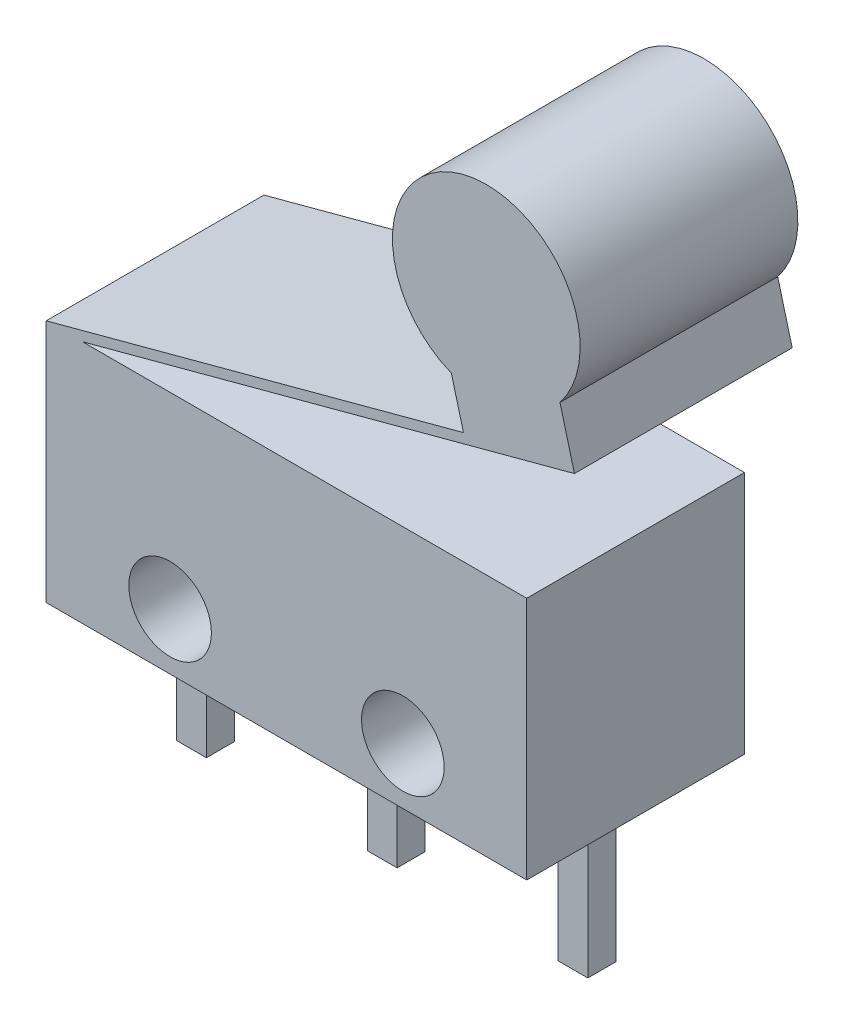
ISO-10303-21;
HEADER;
FILE_DESCRIPTION(('STEP AP214'),'2;1');
FILE_NAME('part.step','',(''),(''),'','','');
FILE_SCHEMA(('AUTOMOTIVE_DESIGN { 1 0 10303 214 1 1 1 1 }'));
ENDSEC;
DATA;
#1=APPLICATION_CONTEXT('core data for automotive mechanical design processes');
#2=APPLICATION_PROTOCOL_DEFINITION('international standard','automotive_design',2000,#1);
#3=PRODUCT_CONTEXT('',#1,'mechanical');
#4=PRODUCT('Part','Part','',(#3));
#5=PRODUCT_RELATED_PRODUCT_CATEGORY('part','',(#4));
#6=PRODUCT_DEFINITION_FORMATION('','',#4);
#7=PRODUCT_DEFINITION_CONTEXT('part definition',#1,'design');
#8=PRODUCT_DEFINITION('design','',#6,#7);
#9=PRODUCT_DEFINITION_SHAPE('','',#8);
#10=(LENGTH_UNIT() NAMED_UNIT(*) SI_UNIT(.MILLI.,.METRE.));
#11=(NAMED_UNIT(*) PLANE_ANGLE_UNIT() SI_UNIT($,.RADIAN.));
#12=(NAMED_UNIT(*) SI_UNIT($,.STERADIAN.) SOLID_ANGLE_UNIT());
#13=UNCERTAINTY_MEASURE_WITH_UNIT(LENGTH_MEASURE(1.E-05),#10,'distance_accuracy_value','');
#14=(GEOMETRIC_REPRESENTATION_CONTEXT(3) GLOBAL_UNCERTAINTY_ASSIGNED_CONTEXT((#13)) GLOBAL_UNIT_ASSIGNED_CONTEXT((#10,
#11,#12)) REPRESENTATION_CONTEXT('',''));
#15=CARTESIAN_POINT('',(0.,0.,0.));
#16=DIRECTION('',(0.,0.,1.));
#17=DIRECTION('',(1.,0.,0.));
#18=AXIS2_PLACEMENT_3D('',#15,#16,#17);
#19=CARTESIAN_POINT('',(0.,0.,5.8));
#20=DIRECTION('',(0.,1.,0.));
#21=DIRECTION('',(0.,0.,1.));
#22=AXIS2_PLACEMENT_3D('',#19,#20,#21);
#23=PLANE('',#22);
#24=DIRECTION('',(0.,0.,-1.));
#25=VECTOR('',#24,1.);
#26=CARTESIAN_POINT('',(6.00191984051225,0.,3.24693340619028));
#27=LINE('',#26,#25);
#28=CARTESIAN_POINT('',(6.00191984051225,0.,3.24693340619028));
#29=VERTEX_POINT('',#28);
#30=CARTESIAN_POINT('',(6.00191984051225,0.,2.49846668640546));
#31=VERTEX_POINT('',#30);
#32=EDGE_CURVE('E196',#29,#31,#27,.T.);
#33=ORIENTED_EDGE('',*,*,#32,.F.);
#34=DIRECTION('',(-1.,0.,0.));
#35=VECTOR('',#34,1.);
#36=CARTESIAN_POINT('',(6.00191984051225,0.,3.24693340619028));
#37=LINE('',#36,#35);
#38=CARTESIAN_POINT('',(6.79356733259234,0.,3.24693340619028));
#39=VERTEX_POINT('',#38);
#40=EDGE_CURVE('E209',#39,#29,#37,.T.);
#41=ORIENTED_EDGE('',*,*,#40,.F.);
#42=DIRECTION('',(0.,0.,1.));
#43=VECTOR('',#42,1.);
#44=CARTESIAN_POINT('',(6.79356733259234,0.,3.24693340619028));
#45=LINE('',#44,#43);
#46=CARTESIAN_POINT('',(6.79356733259234,0.,2.49846668640546));
#47=VERTEX_POINT('',#46);
#48=EDGE_CURVE('E218',#47,#39,#45,.T.);
#49=ORIENTED_EDGE('',*,*,#48,.F.);
#50=DIRECTION('',(1.,0.,0.));
#51=VECTOR('',#50,1.);
#52=CARTESIAN_POINT('',(6.00191984051225,0.,2.49846668640546));
#53=LINE('',#52,#51);
#54=EDGE_CURVE('E199',#31,#47,#53,.T.);
#55=ORIENTED_EDGE('',*,*,#54,.F.);
#56=EDGE_LOOP('',(#33,#41,#49,#55));
#57=FACE_BOUND('',#56,.T.);
#58=DIRECTION('',(1.,0.,0.));
#59=VECTOR('',#58,1.);
#60=CARTESIAN_POINT('',(0.,0.,0.));
#61=LINE('',#60,#59);
#62=CARTESIAN_POINT('',(0.,0.,0.));
#63=VERTEX_POINT('',#62);
#64=CARTESIAN_POINT('',(12.8,0.,0.));
#65=VERTEX_POINT('',#64);
#66=EDGE_CURVE('E313',#63,#65,#61,.T.);
#67=ORIENTED_EDGE('',*,*,#66,.T.);
#68=DIRECTION('',(0.,0.,-1.));
#69=VECTOR('',#68,1.);
#70=CARTESIAN_POINT('',(12.8,0.,5.8));
#71=LINE('',#70,#69);
#72=CARTESIAN_POINT('',(12.8,0.,5.8));
#73=VERTEX_POINT('',#72);
#74=EDGE_CURVE('E329',#73,#65,#71,.T.);
#75=ORIENTED_EDGE('',*,*,#74,.F.);
#76=DIRECTION('',(1.,0.,0.));
#77=VECTOR('',#76,1.);
#78=CARTESIAN_POINT('',(0.,0.,5.8));
#79=LINE('',#78,#77);
#80=CARTESIAN_POINT('',(0.,0.,5.8));
#81=VERTEX_POINT('',#80);
#82=EDGE_CURVE('E284',#81,#73,#79,.T.);
#83=ORIENTED_EDGE('',*,*,#82,.F.);
#84=DIRECTION('',(0.,0.,-1.));
#85=VECTOR('',#84,1.);
#86=CARTESIAN_POINT('',(0.,0.,5.8));
#87=LINE('',#86,#85);
#88=EDGE_CURVE('E332',#81,#63,#87,.T.);
#89=ORIENTED_EDGE('',*,*,#88,.T.);
#90=EDGE_LOOP('',(#67,#75,#83,#89));
#91=FACE_BOUND('',#90,.T.);
#92=DIRECTION('',(0.,0.,-1.));
#93=VECTOR('',#92,1.);
#94=CARTESIAN_POINT('',(0.921919840512247,0.,3.24693340619028));
#95=LINE('',#94,#93);
#96=CARTESIAN_POINT('',(0.921919840512247,0.,3.24693340619028));
#97=VERTEX_POINT('',#96);
#98=CARTESIAN_POINT('',(0.921919840512247,0.,2.49846668640546));
#99=VERTEX_POINT('',#98);
#100=EDGE_CURVE('E234',#97,#99,#95,.T.);
#101=ORIENTED_EDGE('',*,*,#100,.F.);
#102=DIRECTION('',(-1.,0.,0.));
#103=VECTOR('',#102,1.);
#104=CARTESIAN_POINT('',(0.921919840512247,0.,3.24693340619028));
#105=LINE('',#104,#103);
#106=CARTESIAN_POINT('',(1.71356733259234,0.,3.24693340619028));
#107=VERTEX_POINT('',#106);
#108=EDGE_CURVE('E239',#107,#97,#105,.T.);
#109=ORIENTED_EDGE('',*,*,#108,.F.);
#110=DIRECTION('',(0.,0.,1.));
#111=VECTOR('',#110,1.);
#112=CARTESIAN_POINT('',(1.71356733259234,0.,3.24693340619028));
#113=LINE('',#112,#111);
#114=CARTESIAN_POINT('',(1.71356733259234,0.,2.49846668640546));
#115=VERTEX_POINT('',#114);
#116=EDGE_CURVE('E251',#115,#107,#113,.T.);
#117=ORIENTED_EDGE('',*,*,#116,.F.);
#118=DIRECTION('',(1.,0.,0.));
#119=VECTOR('',#118,1.);
#120=CARTESIAN_POINT('',(0.921919840512247,0.,2.49846668640546));
#121=LINE('',#120,#119);
#122=EDGE_CURVE('E248',#99,#115,#121,.T.);
#123=ORIENTED_EDGE('',*,*,#122,.F.);
#124=EDGE_LOOP('',(#101,#109,#117,#123));
#125=FACE_BOUND('',#124,.T.);
#126=DIRECTION('',(0.,0.,-1.));
#127=VECTOR('',#126,1.);
#128=CARTESIAN_POINT('',(11.0819198405122,0.,3.24693340619028));
#129=LINE('',#128,#127);
#130=CARTESIAN_POINT('',(11.0819198405122,0.,3.24693340619028));
#131=VERTEX_POINT('',#130);
#132=CARTESIAN_POINT('',(11.0819198405122,0.,2.49846668640546));
#133=VERTEX_POINT('',#132);
#134=EDGE_CURVE('E195',#131,#133,#129,.T.);
#135=ORIENTED_EDGE('',*,*,#134,.F.);
#136=DIRECTION('',(-1.,0.,0.));
#137=VECTOR('',#136,1.);
#138=CARTESIAN_POINT('',(11.0819198405122,0.,3.24693340619028));
#139=LINE('',#138,#137);
#140=CARTESIAN_POINT('',(11.8735673325923,0.,3.24693340619028));
#141=VERTEX_POINT('',#140);
#142=EDGE_CURVE('E192',#141,#131,#139,.T.);
#143=ORIENTED_EDGE('',*,*,#142,.F.);
#144=DIRECTION('',(0.,0.,1.));
#145=VECTOR('',#144,1.);
#146=CARTESIAN_POINT('',(11.8735673325923,0.,3.24693340619028));
#147=LINE('',#146,#145);
#148=CARTESIAN_POINT('',(11.8735673325923,0.,2.49846668640546));
#149=VERTEX_POINT('',#148);
#150=EDGE_CURVE('E53',#149,#141,#147,.T.);
#151=ORIENTED_EDGE('',*,*,#150,.F.);
#152=DIRECTION('',(1.,0.,0.));
#153=VECTOR('',#152,1.);
#154=CARTESIAN_POINT('',(11.0819198405122,0.,2.49846668640546));
#155=LINE('',#154,#153);
#156=EDGE_CURVE('E48',#133,#149,#155,.T.);
#157=ORIENTED_EDGE('',*,*,#156,.F.);
#158=EDGE_LOOP('',(#135,#143,#151,#157));
#159=FACE_BOUND('',#158,.T.);
#160=ADVANCED_FACE('F33',(#57,#91,#125,#159),#23,.F.);
#161=CARTESIAN_POINT('',(-1.56029523872434,5.82310110572718,5.8));
#162=DIRECTION('',(0.258819045102515,-0.96592582628907,0.));
#163=DIRECTION('',(0.96592582628907,0.258819045102515,0.));
#164=AXIS2_PLACEMENT_3D('',#161,#162,#163);
#165=PLANE('',#164);
#166=DIRECTION('',(-0.96592582628907,-0.258819045102515,0.));
#167=VECTOR('',#166,1.);
#168=CARTESIAN_POINT('',(-1.56029523872434,5.82310110572718,0.));
#169=LINE('',#168,#167);
#170=CARTESIAN_POINT('',(14.0706292424671,10.0113946974142,0.));
#171=VERTEX_POINT('',#170);
#172=CARTESIAN_POINT('',(0.96592582628909,6.5,0.));
#173=VERTEX_POINT('',#172);
#174=EDGE_CURVE('E267',#171,#173,#169,.T.);
#175=ORIENTED_EDGE('',*,*,#174,.F.);
#176=DIRECTION('',(0.,0.,-1.));
#177=VECTOR('',#176,1.);
#178=CARTESIAN_POINT('',(14.0706292424671,10.0113946974142,5.8));
#179=LINE('',#178,#177);
#180=CARTESIAN_POINT('',(14.0706292424671,10.0113946974142,5.8));
#181=VERTEX_POINT('',#180);
#182=EDGE_CURVE('E11',#181,#171,#179,.T.);
#183=ORIENTED_EDGE('',*,*,#182,.F.);
#184=DIRECTION('',(-0.96592582628907,-0.258819045102515,0.));
#185=VECTOR('',#184,1.);
#186=CARTESIAN_POINT('',(-1.56029523872434,5.82310110572718,5.8));
#187=LINE('',#186,#185);
#188=CARTESIAN_POINT('',(0.96592582628909,6.5,5.8));
#189=VERTEX_POINT('',#188);
#190=EDGE_CURVE('E268',#181,#189,#187,.T.);
#191=ORIENTED_EDGE('',*,*,#190,.T.);
#192=DIRECTION('',(0.,0.,-1.));
#193=VECTOR('',#192,1.);
#194=CARTESIAN_POINT('',(0.96592582628909,6.5,5.8));
#195=LINE('',#194,#193);
#196=EDGE_CURVE('E297',#189,#173,#195,.T.);
#197=ORIENTED_EDGE('',*,*,#196,.T.);
#198=EDGE_LOOP('',(#175,#183,#191,#197));
#199=FACE_BOUND('',#198,.T.);
#200=ADVANCED_FACE('F35',(#199),#165,.T.);
#201=CARTESIAN_POINT('',(15.6285144414881,4.16333482830734,5.8));
#202=DIRECTION('',(-0.966300622076411,-0.257416215057911,0.));
#203=DIRECTION('',(0.257416215057911,-0.966300622076411,0.));
#204=AXIS2_PLACEMENT_3D('',#201,#202,#203);
#205=PLANE('',#204);
#206=DIRECTION('',(-0.257416215057911,0.966300622076411,0.));
#207=VECTOR('',#206,1.);
#208=CARTESIAN_POINT('',(15.6285144414881,4.16333482830734,0.));
#209=LINE('',#208,#207);
#210=CARTESIAN_POINT('',(13.6849252475449,11.4592677855447,0.));
#211=VERTEX_POINT('',#210);
#212=EDGE_CURVE('E300',#171,#211,#209,.T.);
#213=ORIENTED_EDGE('',*,*,#212,.T.);
#214=DIRECTION('',(0.,0.,-1.));
#215=VECTOR('',#214,1.);
#216=CARTESIAN_POINT('',(13.6849252475449,11.4592677855447,5.8));
#217=LINE('',#216,#215);
#218=CARTESIAN_POINT('',(13.6849252475449,11.4592677855447,5.8));
#219=VERTEX_POINT('',#218);
#220=EDGE_CURVE('E41',#219,#211,#217,.T.);
#221=ORIENTED_EDGE('',*,*,#220,.F.);
#222=DIRECTION('',(-0.257416215057911,0.966300622076411,0.));
#223=VECTOR('',#222,1.);
#224=CARTESIAN_POINT('',(15.6285144414881,4.16333482830734,5.8));
#225=LINE('',#224,#223);
#226=EDGE_CURVE('E271',#181,#219,#225,.T.);
#227=ORIENTED_EDGE('',*,*,#226,.F.);
#228=ORIENTED_EDGE('',*,*,#182,.T.);
#229=EDGE_LOOP('',(#213,#221,#227,#228));
#230=FACE_BOUND('',#229,.T.);
#231=ADVANCED_FACE('F367',(#230),#205,.F.);
#232=CARTESIAN_POINT('',(11.7223277390042,13.0078836254062,5.8));
#233=DIRECTION('',(0.,0.,-1.));
#234=DIRECTION('',(-1.,0.,0.));
#235=AXIS2_PLACEMENT_3D('',#232,#233,#234);
#236=CYLINDRICAL_SURFACE('',#235,2.49999999999999);
#237=CARTESIAN_POINT('',(11.7223277390042,13.0078836254062,0.));
#238=DIRECTION('',(0.,0.,1.));
#239=DIRECTION('',(1.,0.,0.));
#240=AXIS2_PLACEMENT_3D('',#237,#238,#239);
#241=CIRCLE('',#240,2.49999999999999);
#242=CARTESIAN_POINT('',(10.7910770897756,10.6878034051743,0.));
#243=VERTEX_POINT('',#242);
#244=EDGE_CURVE('E302',#211,#243,#241,.T.);
#245=ORIENTED_EDGE('',*,*,#244,.T.);
#246=DIRECTION('',(0.,0.,-1.));
#247=VECTOR('',#246,1.);
#248=CARTESIAN_POINT('',(10.7910770897756,10.6878034051743,5.8));
#249=LINE('',#248,#247);
#250=CARTESIAN_POINT('',(10.7910770897756,10.6878034051743,5.8));
#251=VERTEX_POINT('',#250);
#252=EDGE_CURVE('E338',#251,#243,#249,.T.);
#253=ORIENTED_EDGE('',*,*,#252,.F.);
#254=CARTESIAN_POINT('',(11.7223277390042,13.0078836254062,5.8));
#255=DIRECTION('',(0.,0.,1.));
#256=DIRECTION('',(1.,0.,0.));
#257=AXIS2_PLACEMENT_3D('',#254,#255,#256);
#258=CIRCLE('',#257,2.49999999999999);
#259=EDGE_CURVE('E274',#219,#251,#258,.T.);
#260=ORIENTED_EDGE('',*,*,#259,.F.);
#261=ORIENTED_EDGE('',*,*,#220,.T.);
#262=EDGE_LOOP('',(#245,#253,#260,#261));
#263=FACE_BOUND('',#262,.T.);
#264=ADVANCED_FACE('F345',(#263),#236,.T.);
#265=CARTESIAN_POINT('',(12.7401628431524,3.41371634526361,5.8));
#266=DIRECTION('',(0.965925826289069,0.258819045102517,0.));
#267=DIRECTION('',(-0.258819045102517,0.96592582628907,0.));
#268=AXIS2_PLACEMENT_3D('',#265,#266,#267);
#269=PLANE('',#268);
#270=DIRECTION('',(0.258819045102517,-0.965925826289069,0.));
#271=VECTOR('',#270,1.);
#272=CARTESIAN_POINT('',(12.7401628431524,3.41371634526361,0.));
#273=LINE('',#272,#271);
#274=CARTESIAN_POINT('',(11.1151628431524,9.47829890756303,0.));
#275=VERTEX_POINT('',#274);
#276=EDGE_CURVE('E304',#243,#275,#273,.T.);
#277=ORIENTED_EDGE('',*,*,#276,.T.);
#278=DIRECTION('',(0.,0.,-1.));
#279=VECTOR('',#278,1.);
#280=CARTESIAN_POINT('',(11.1151628431524,9.47829890756303,5.8));
#281=LINE('',#280,#279);
#282=CARTESIAN_POINT('',(11.1151628431524,9.47829890756303,5.8));
#283=VERTEX_POINT('',#282);
#284=EDGE_CURVE('E336',#283,#275,#281,.T.);
#285=ORIENTED_EDGE('',*,*,#284,.F.);
#286=DIRECTION('',(0.258819045102517,-0.965925826289069,0.));
#287=VECTOR('',#286,1.);
#288=CARTESIAN_POINT('',(12.7401628431524,3.41371634526361,5.8));
#289=LINE('',#288,#287);
#290=EDGE_CURVE('E276',#251,#283,#289,.T.);
#291=ORIENTED_EDGE('',*,*,#290,.F.);
#292=ORIENTED_EDGE('',*,*,#252,.T.);
#293=EDGE_LOOP('',(#277,#285,#291,#292));
#294=FACE_BOUND('',#293,.T.);
#295=ADVANCED_FACE('F358',(#294),#269,.F.);
#296=CARTESIAN_POINT('',(-1.62499999999996,6.06458256229945,5.8));
#297=DIRECTION('',(-0.258819045102515,0.96592582628907,0.));
#298=DIRECTION('',(-0.96592582628907,-0.258819045102515,0.));
#299=AXIS2_PLACEMENT_3D('',#296,#297,#298);
#300=PLANE('',#299);
#301=DIRECTION('',(0.96592582628907,0.258819045102515,0.));
#302=VECTOR('',#301,1.);
#303=CARTESIAN_POINT('',(-1.62499999999996,6.06458256229945,0.));
#304=LINE('',#303,#302);
#305=CARTESIAN_POINT('',(0.,6.5,0.));
#306=VERTEX_POINT('',#305);
#307=EDGE_CURVE('E307',#306,#275,#304,.T.);
#308=ORIENTED_EDGE('',*,*,#307,.F.);
#309=DIRECTION('',(0.,0.,-1.));
#310=VECTOR('',#309,1.);
#311=CARTESIAN_POINT('',(0.,6.5,5.8));
#312=LINE('',#311,#310);
#313=CARTESIAN_POINT('',(0.,6.5,5.8));
#314=VERTEX_POINT('',#313);
#315=EDGE_CURVE('E334',#314,#306,#312,.T.);
#316=ORIENTED_EDGE('',*,*,#315,.F.);
#317=DIRECTION('',(0.96592582628907,0.258819045102515,0.));
#318=VECTOR('',#317,1.);
#319=CARTESIAN_POINT('',(-1.62499999999996,6.06458256229945,5.8));
#320=LINE('',#319,#318);
#321=EDGE_CURVE('E278',#314,#283,#320,.T.);
#322=ORIENTED_EDGE('',*,*,#321,.T.);
#323=ORIENTED_EDGE('',*,*,#284,.T.);
#324=EDGE_LOOP('',(#308,#316,#322,#323));
#325=FACE_BOUND('',#324,.T.);
#326=ADVANCED_FACE('F385',(#325),#300,.T.);
#327=CARTESIAN_POINT('',(0.,0.,5.8));
#328=DIRECTION('',(-1.,0.,0.));
#329=DIRECTION('',(0.,0.,1.));
#330=AXIS2_PLACEMENT_3D('',#327,#328,#329);
#331=PLANE('',#330);
#332=DIRECTION('',(0.,1.,0.));
#333=VECTOR('',#332,1.);
#334=CARTESIAN_POINT('',(0.,0.,0.));
#335=LINE('',#334,#333);
#336=EDGE_CURVE('E310',#63,#306,#335,.T.);
#337=ORIENTED_EDGE('',*,*,#336,.F.);
#338=ORIENTED_EDGE('',*,*,#88,.F.);
#339=DIRECTION('',(0.,1.,0.));
#340=VECTOR('',#339,1.);
#341=CARTESIAN_POINT('',(0.,0.,5.8));
#342=LINE('',#341,#340);
#343=EDGE_CURVE('E281',#81,#314,#342,.T.);
#344=ORIENTED_EDGE('',*,*,#343,.T.);
#345=ORIENTED_EDGE('',*,*,#315,.T.);
#346=EDGE_LOOP('',(#337,#338,#344,#345));
#347=FACE_BOUND('',#346,.T.);
#348=ADVANCED_FACE('F382',(#347),#331,.T.);
#349=CARTESIAN_POINT('',(12.8,0.,5.8));
#350=DIRECTION('',(-1.,0.,0.));
#351=DIRECTION('',(0.,0.,1.));
#352=AXIS2_PLACEMENT_3D('',#349,#350,#351);
#353=PLANE('',#352);
#354=DIRECTION('',(0.,1.,0.));
#355=VECTOR('',#354,1.);
#356=CARTESIAN_POINT('',(12.8,0.,0.));
#357=LINE('',#356,#355);
#358=CARTESIAN_POINT('',(12.8,6.5,0.));
#359=VERTEX_POINT('',#358);
#360=EDGE_CURVE('E315',#65,#359,#357,.T.);
#361=ORIENTED_EDGE('',*,*,#360,.T.);
#362=DIRECTION('',(0.,0.,-1.));
#363=VECTOR('',#362,1.);
#364=CARTESIAN_POINT('',(12.8,6.5,5.8));
#365=LINE('',#364,#363);
#366=CARTESIAN_POINT('',(12.8,6.5,5.8));
#367=VERTEX_POINT('',#366);
#368=EDGE_CURVE('E327',#367,#359,#365,.T.);
#369=ORIENTED_EDGE('',*,*,#368,.F.);
#370=DIRECTION('',(0.,1.,0.));
#371=VECTOR('',#370,1.);
#372=CARTESIAN_POINT('',(12.8,0.,5.8));
#373=LINE('',#372,#371);
#374=EDGE_CURVE('E286',#73,#367,#373,.T.);
#375=ORIENTED_EDGE('',*,*,#374,.F.);
#376=ORIENTED_EDGE('',*,*,#74,.T.);
#377=EDGE_LOOP('',(#361,#369,#375,#376));
#378=FACE_BOUND('',#377,.T.);
#379=ADVANCED_FACE('F376',(#378),#353,.F.);
#380=CARTESIAN_POINT('',(9.5,1.5,5.8));
#381=DIRECTION('',(0.,0.,-1.));
#382=DIRECTION('',(-1.,0.,0.));
#383=AXIS2_PLACEMENT_3D('',#380,#381,#382);
#384=CYLINDRICAL_SURFACE('',#383,1.1);
#385=CARTESIAN_POINT('',(9.5,1.5,5.8));
#386=DIRECTION('',(0.,0.,1.));
#387=DIRECTION('',(1.,0.,0.));
#388=AXIS2_PLACEMENT_3D('',#385,#386,#387);
#389=CIRCLE('',#388,1.1);
#390=CARTESIAN_POINT('',(10.6,1.5,5.8));
#391=VERTEX_POINT('',#390);
#392=EDGE_CURVE('E291',#391,#391,#389,.T.);
#393=ORIENTED_EDGE('',*,*,#392,.T.);
#394=EDGE_LOOP('',(#393));
#395=FACE_BOUND('',#394,.T.);
#396=CARTESIAN_POINT('',(9.5,1.5,0.));
#397=DIRECTION('',(0.,0.,1.));
#398=DIRECTION('',(1.,0.,0.));
#399=AXIS2_PLACEMENT_3D('',#396,#397,#398);
#400=CIRCLE('',#399,1.1);
#401=CARTESIAN_POINT('',(10.6,1.5,0.));
#402=VERTEX_POINT('',#401);
#403=EDGE_CURVE('E321',#402,#402,#400,.T.);
#404=ORIENTED_EDGE('',*,*,#403,.F.);
#405=EDGE_LOOP('',(#404));
#406=FACE_BOUND('',#405,.T.);
#407=ADVANCED_FACE('F403',(#395,#406),#384,.F.);
#408=CARTESIAN_POINT('',(0.,6.5,5.8));
#409=DIRECTION('',(0.,1.,0.));
#410=DIRECTION('',(0.,0.,1.));
#411=AXIS2_PLACEMENT_3D('',#408,#409,#410);
#412=PLANE('',#411);
#413=DIRECTION('',(1.,0.,0.));
#414=VECTOR('',#413,1.);
#415=CARTESIAN_POINT('',(0.,6.5,0.));
#416=LINE('',#415,#414);
#417=EDGE_CURVE('E318',#173,#359,#416,.T.);
#418=ORIENTED_EDGE('',*,*,#417,.F.);
#419=ORIENTED_EDGE('',*,*,#196,.F.);
#420=DIRECTION('',(1.,0.,0.));
#421=VECTOR('',#420,1.);
#422=CARTESIAN_POINT('',(0.,6.5,5.8));
#423=LINE('',#422,#421);
#424=EDGE_CURVE('E288',#189,#367,#423,.T.);
#425=ORIENTED_EDGE('',*,*,#424,.T.);
#426=ORIENTED_EDGE('',*,*,#368,.T.);
#427=EDGE_LOOP('',(#418,#419,#425,#426));
#428=FACE_BOUND('',#427,.T.);
#429=ADVANCED_FACE('F372',(#428),#412,.T.);
#430=CARTESIAN_POINT('',(3.3,1.5,5.8));
#431=DIRECTION('',(0.,0.,-1.));
#432=DIRECTION('',(-1.,0.,0.));
#433=AXIS2_PLACEMENT_3D('',#430,#431,#432);
#434=CYLINDRICAL_SURFACE('',#433,1.1);
#435=CARTESIAN_POINT('',(3.3,1.5,5.8));
#436=DIRECTION('',(0.,0.,1.));
#437=DIRECTION('',(1.,0.,0.));
#438=AXIS2_PLACEMENT_3D('',#435,#436,#437);
#439=CIRCLE('',#438,1.1);
#440=CARTESIAN_POINT('',(4.4,1.5,5.8));
#441=VERTEX_POINT('',#440);
#442=EDGE_CURVE('E294',#441,#441,#439,.T.);
#443=ORIENTED_EDGE('',*,*,#442,.T.);
#444=EDGE_LOOP('',(#443));
#445=FACE_BOUND('',#444,.T.);
#446=CARTESIAN_POINT('',(3.3,1.5,0.));
#447=DIRECTION('',(0.,0.,1.));
#448=DIRECTION('',(1.,0.,0.));
#449=AXIS2_PLACEMENT_3D('',#446,#447,#448);
#450=CIRCLE('',#449,1.1);
#451=CARTESIAN_POINT('',(4.4,1.5,0.));
#452=VERTEX_POINT('',#451);
#453=EDGE_CURVE('E272',#452,#452,#450,.T.);
#454=ORIENTED_EDGE('',*,*,#453,.F.);
#455=EDGE_LOOP('',(#454));
#456=FACE_BOUND('',#455,.T.);
#457=ADVANCED_FACE('F406',(#445,#456),#434,.F.);
#458=CARTESIAN_POINT('',(0.,0.,5.8));
#459=DIRECTION('',(0.,0.,1.));
#460=DIRECTION('',(1.,0.,0.));
#461=AXIS2_PLACEMENT_3D('',#458,#459,#460);
#462=PLANE('',#461);
#463=ORIENTED_EDGE('',*,*,#190,.F.);
#464=ORIENTED_EDGE('',*,*,#226,.T.);
#465=ORIENTED_EDGE('',*,*,#259,.T.);
#466=ORIENTED_EDGE('',*,*,#290,.T.);
#467=ORIENTED_EDGE('',*,*,#321,.F.);
#468=ORIENTED_EDGE('',*,*,#343,.F.);
#469=ORIENTED_EDGE('',*,*,#82,.T.);
#470=ORIENTED_EDGE('',*,*,#374,.T.);
#471=ORIENTED_EDGE('',*,*,#424,.F.);
#472=EDGE_LOOP('',(#463,#464,#465,#466,#467,#468,#469,#470,#471));
#473=FACE_BOUND('',#472,.T.);
#474=ORIENTED_EDGE('',*,*,#392,.F.);
#475=EDGE_LOOP('',(#474));
#476=FACE_BOUND('',#475,.T.);
#477=ORIENTED_EDGE('',*,*,#442,.F.);
#478=EDGE_LOOP('',(#477));
#479=FACE_BOUND('',#478,.T.);
#480=ADVANCED_FACE('F363',(#473,#476,#479),#462,.T.);
#481=CARTESIAN_POINT('',(0.,0.,0.));
#482=DIRECTION('',(0.,0.,1.));
#483=DIRECTION('',(1.,0.,0.));
#484=AXIS2_PLACEMENT_3D('',#481,#482,#483);
#485=PLANE('',#484);
#486=ORIENTED_EDGE('',*,*,#174,.T.);
#487=ORIENTED_EDGE('',*,*,#417,.T.);
#488=ORIENTED_EDGE('',*,*,#360,.F.);
#489=ORIENTED_EDGE('',*,*,#66,.F.);
#490=ORIENTED_EDGE('',*,*,#336,.T.);
#491=ORIENTED_EDGE('',*,*,#307,.T.);
#492=ORIENTED_EDGE('',*,*,#276,.F.);
#493=ORIENTED_EDGE('',*,*,#244,.F.);
#494=ORIENTED_EDGE('',*,*,#212,.F.);
#495=EDGE_LOOP('',(#486,#487,#488,#489,#490,#491,#492,#493,#494));
#496=FACE_BOUND('',#495,.T.);
#497=ORIENTED_EDGE('',*,*,#403,.T.);
#498=EDGE_LOOP('',(#497));
#499=FACE_BOUND('',#498,.T.);
#500=ORIENTED_EDGE('',*,*,#453,.T.);
#501=EDGE_LOOP('',(#500));
#502=FACE_BOUND('',#501,.T.);
#503=ADVANCED_FACE('F352',(#496,#499,#502),#485,.F.);
#504=CARTESIAN_POINT('',(0.921919840512247,-4.,3.24693340619028));
#505=DIRECTION('',(1.,0.,0.));
#506=DIRECTION('',(0.,0.,-1.));
#507=AXIS2_PLACEMENT_3D('',#504,#505,#506);
#508=PLANE('',#507);
#509=ORIENTED_EDGE('',*,*,#100,.T.);
#510=DIRECTION('',(0.,1.,0.));
#511=VECTOR('',#510,1.);
#512=CARTESIAN_POINT('',(0.921919840512247,-4.,2.49846668640546));
#513=LINE('',#512,#511);
#514=CARTESIAN_POINT('',(0.921919840512247,-4.,2.49846668640546));
#515=VERTEX_POINT('',#514);
#516=EDGE_CURVE('E264',#515,#99,#513,.T.);
#517=ORIENTED_EDGE('',*,*,#516,.F.);
#518=DIRECTION('',(0.,0.,-1.));
#519=VECTOR('',#518,1.);
#520=CARTESIAN_POINT('',(0.921919840512247,-4.,3.24693340619028));
#521=LINE('',#520,#519);
#522=CARTESIAN_POINT('',(0.921919840512247,-4.,3.24693340619028));
#523=VERTEX_POINT('',#522);
#524=EDGE_CURVE('E235',#523,#515,#521,.T.);
#525=ORIENTED_EDGE('',*,*,#524,.F.);
#526=DIRECTION('',(0.,1.,0.));
#527=VECTOR('',#526,1.);
#528=CARTESIAN_POINT('',(0.921919840512247,-4.,3.24693340619028));
#529=LINE('',#528,#527);
#530=EDGE_CURVE('E245',#523,#97,#529,.T.);
#531=ORIENTED_EDGE('',*,*,#530,.T.);
#532=EDGE_LOOP('',(#509,#517,#525,#531));
#533=FACE_BOUND('',#532,.T.);
#534=ADVANCED_FACE('F415',(#533),#508,.F.);
#535=CARTESIAN_POINT('',(0.921919840512247,-4.,2.49846668640546));
#536=DIRECTION('',(0.,0.,1.));
#537=DIRECTION('',(1.,0.,0.));
#538=AXIS2_PLACEMENT_3D('',#535,#536,#537);
#539=PLANE('',#538);
#540=ORIENTED_EDGE('',*,*,#122,.T.);
#541=DIRECTION('',(0.,1.,0.));
#542=VECTOR('',#541,1.);
#543=CARTESIAN_POINT('',(1.71356733259234,-4.,2.49846668640546));
#544=LINE('',#543,#542);
#545=CARTESIAN_POINT('',(1.71356733259234,-4.,2.49846668640546));
#546=VERTEX_POINT('',#545);
#547=EDGE_CURVE('E261',#546,#115,#544,.T.);
#548=ORIENTED_EDGE('',*,*,#547,.F.);
#549=DIRECTION('',(1.,0.,0.));
#550=VECTOR('',#549,1.);
#551=CARTESIAN_POINT('',(0.921919840512247,-4.,2.49846668640546));
#552=LINE('',#551,#550);
#553=EDGE_CURVE('E238',#515,#546,#552,.T.);
#554=ORIENTED_EDGE('',*,*,#553,.F.);
#555=ORIENTED_EDGE('',*,*,#516,.T.);
#556=EDGE_LOOP('',(#540,#548,#554,#555));
#557=FACE_BOUND('',#556,.T.);
#558=ADVANCED_FACE('F420',(#557),#539,.F.);
#559=CARTESIAN_POINT('',(1.71356733259234,-4.,3.24693340619028));
#560=DIRECTION('',(-1.,0.,0.));
#561=DIRECTION('',(0.,0.,1.));
#562=AXIS2_PLACEMENT_3D('',#559,#560,#561);
#563=PLANE('',#562);
#564=ORIENTED_EDGE('',*,*,#116,.T.);
#565=DIRECTION('',(0.,1.,0.));
#566=VECTOR('',#565,1.);
#567=CARTESIAN_POINT('',(1.71356733259234,-4.,3.24693340619028));
#568=LINE('',#567,#566);
#569=CARTESIAN_POINT('',(1.71356733259234,-4.,3.24693340619028));
#570=VERTEX_POINT('',#569);
#571=EDGE_CURVE('E258',#570,#107,#568,.T.);
#572=ORIENTED_EDGE('',*,*,#571,.F.);
#573=DIRECTION('',(0.,0.,1.));
#574=VECTOR('',#573,1.);
#575=CARTESIAN_POINT('',(1.71356733259234,-4.,3.24693340619028));
#576=LINE('',#575,#574);
#577=EDGE_CURVE('E241',#546,#570,#576,.T.);
#578=ORIENTED_EDGE('',*,*,#577,.F.);
#579=ORIENTED_EDGE('',*,*,#547,.T.);
#580=EDGE_LOOP('',(#564,#572,#578,#579));
#581=FACE_BOUND('',#580,.T.);
#582=ADVANCED_FACE('F424',(#581),#563,.F.);
#583=CARTESIAN_POINT('',(0.921919840512247,-4.,3.24693340619028));
#584=DIRECTION('',(0.,0.,-1.));
#585=DIRECTION('',(-1.,0.,0.));
#586=AXIS2_PLACEMENT_3D('',#583,#584,#585);
#587=PLANE('',#586);
#588=ORIENTED_EDGE('',*,*,#108,.T.);
#589=ORIENTED_EDGE('',*,*,#530,.F.);
#590=DIRECTION('',(-1.,0.,0.));
#591=VECTOR('',#590,1.);
#592=CARTESIAN_POINT('',(0.921919840512247,-4.,3.24693340619028));
#593=LINE('',#592,#591);
#594=EDGE_CURVE('E243',#570,#523,#593,.T.);
#595=ORIENTED_EDGE('',*,*,#594,.F.);
#596=ORIENTED_EDGE('',*,*,#571,.T.);
#597=EDGE_LOOP('',(#588,#589,#595,#596));
#598=FACE_BOUND('',#597,.T.);
#599=ADVANCED_FACE('F428',(#598),#587,.F.);
#600=CARTESIAN_POINT('',(0.,-4.,0.));
#601=DIRECTION('',(0.,-1.,0.));
#602=DIRECTION('',(0.,0.,-1.));
#603=AXIS2_PLACEMENT_3D('',#600,#601,#602);
#604=PLANE('',#603);
#605=ORIENTED_EDGE('',*,*,#524,.T.);
#606=ORIENTED_EDGE('',*,*,#553,.T.);
#607=ORIENTED_EDGE('',*,*,#577,.T.);
#608=ORIENTED_EDGE('',*,*,#594,.T.);
#609=EDGE_LOOP('',(#605,#606,#607,#608));
#610=FACE_BOUND('',#609,.T.);
#611=ADVANCED_FACE('F432',(#610),#604,.T.);
#612=CARTESIAN_POINT('',(6.00191984051225,-4.,3.24693340619028));
#613=DIRECTION('',(1.,0.,0.));
#614=DIRECTION('',(0.,0.,-1.));
#615=AXIS2_PLACEMENT_3D('',#612,#613,#614);
#616=PLANE('',#615);
#617=ORIENTED_EDGE('',*,*,#32,.T.);
#618=DIRECTION('',(0.,1.,0.));
#619=VECTOR('',#618,1.);
#620=CARTESIAN_POINT('',(6.00191984051225,-4.,2.49846668640546));
#621=LINE('',#620,#619);
#622=CARTESIAN_POINT('',(6.00191984051225,-4.,2.49846668640546));
#623=VERTEX_POINT('',#622);
#624=EDGE_CURVE('E231',#623,#31,#621,.T.);
#625=ORIENTED_EDGE('',*,*,#624,.F.);
#626=DIRECTION('',(0.,0.,-1.));
#627=VECTOR('',#626,1.);
#628=CARTESIAN_POINT('',(6.00191984051225,-4.,3.24693340619028));
#629=LINE('',#628,#627);
#630=CARTESIAN_POINT('',(6.00191984051225,-4.,3.24693340619028));
#631=VERTEX_POINT('',#630);
#632=EDGE_CURVE('E205',#631,#623,#629,.T.);
#633=ORIENTED_EDGE('',*,*,#632,.F.);
#634=DIRECTION('',(0.,1.,0.));
#635=VECTOR('',#634,1.);
#636=CARTESIAN_POINT('',(6.00191984051225,-4.,3.24693340619028));
#637=LINE('',#636,#635);
#638=EDGE_CURVE('E214',#631,#29,#637,.T.);
#639=ORIENTED_EDGE('',*,*,#638,.T.);
#640=EDGE_LOOP('',(#617,#625,#633,#639));
#641=FACE_BOUND('',#640,.T.);
#642=ADVANCED_FACE('F436',(#641),#616,.F.);
#643=CARTESIAN_POINT('',(6.00191984051225,-4.,2.49846668640546));
#644=DIRECTION('',(0.,0.,1.));
#645=DIRECTION('',(1.,0.,0.));
#646=AXIS2_PLACEMENT_3D('',#643,#644,#645);
#647=PLANE('',#646);
#648=ORIENTED_EDGE('',*,*,#54,.T.);
#649=DIRECTION('',(0.,1.,0.));
#650=VECTOR('',#649,1.);
#651=CARTESIAN_POINT('',(6.79356733259234,-4.,2.49846668640546));
#652=LINE('',#651,#650);
#653=CARTESIAN_POINT('',(6.79356733259234,-4.,2.49846668640546));
#654=VERTEX_POINT('',#653);
#655=EDGE_CURVE('E228',#654,#47,#652,.T.);
#656=ORIENTED_EDGE('',*,*,#655,.F.);
#657=DIRECTION('',(1.,0.,0.));
#658=VECTOR('',#657,1.);
#659=CARTESIAN_POINT('',(6.00191984051225,-4.,2.49846668640546));
#660=LINE('',#659,#658);
#661=EDGE_CURVE('E208',#623,#654,#660,.T.);
#662=ORIENTED_EDGE('',*,*,#661,.F.);
#663=ORIENTED_EDGE('',*,*,#624,.T.);
#664=EDGE_LOOP('',(#648,#656,#662,#663));
#665=FACE_BOUND('',#664,.T.);
#666=ADVANCED_FACE('F440',(#665),#647,.F.);
#667=CARTESIAN_POINT('',(6.79356733259234,-4.,3.24693340619028));
#668=DIRECTION('',(-1.,0.,0.));
#669=DIRECTION('',(0.,0.,1.));
#670=AXIS2_PLACEMENT_3D('',#667,#668,#669);
#671=PLANE('',#670);
#672=ORIENTED_EDGE('',*,*,#48,.T.);
#673=DIRECTION('',(0.,1.,0.));
#674=VECTOR('',#673,1.);
#675=CARTESIAN_POINT('',(6.79356733259234,-4.,3.24693340619028));
#676=LINE('',#675,#674);
#677=CARTESIAN_POINT('',(6.79356733259234,-4.,3.24693340619028));
#678=VERTEX_POINT('',#677);
#679=EDGE_CURVE('E225',#678,#39,#676,.T.);
#680=ORIENTED_EDGE('',*,*,#679,.F.);
#681=DIRECTION('',(0.,0.,1.));
#682=VECTOR('',#681,1.);
#683=CARTESIAN_POINT('',(6.79356733259234,-4.,3.24693340619028));
#684=LINE('',#683,#682);
#685=EDGE_CURVE('E211',#654,#678,#684,.T.);
#686=ORIENTED_EDGE('',*,*,#685,.F.);
#687=ORIENTED_EDGE('',*,*,#655,.T.);
#688=EDGE_LOOP('',(#672,#680,#686,#687));
#689=FACE_BOUND('',#688,.T.);
#690=ADVANCED_FACE('F444',(#689),#671,.F.);
#691=CARTESIAN_POINT('',(6.00191984051225,-4.,3.24693340619028));
#692=DIRECTION('',(0.,0.,-1.));
#693=DIRECTION('',(-1.,0.,0.));
#694=AXIS2_PLACEMENT_3D('',#691,#692,#693);
#695=PLANE('',#694);
#696=ORIENTED_EDGE('',*,*,#40,.T.);
#697=ORIENTED_EDGE('',*,*,#638,.F.);
#698=DIRECTION('',(-1.,0.,0.));
#699=VECTOR('',#698,1.);
#700=CARTESIAN_POINT('',(6.00191984051225,-4.,3.24693340619028));
#701=LINE('',#700,#699);
#702=EDGE_CURVE('E213',#678,#631,#701,.T.);
#703=ORIENTED_EDGE('',*,*,#702,.F.);
#704=ORIENTED_EDGE('',*,*,#679,.T.);
#705=EDGE_LOOP('',(#696,#697,#703,#704));
#706=FACE_BOUND('',#705,.T.);
#707=ADVANCED_FACE('F448',(#706),#695,.F.);
#708=CARTESIAN_POINT('',(0.,-4.,0.));
#709=DIRECTION('',(0.,-1.,0.));
#710=DIRECTION('',(0.,0.,-1.));
#711=AXIS2_PLACEMENT_3D('',#708,#709,#710);
#712=PLANE('',#711);
#713=ORIENTED_EDGE('',*,*,#632,.T.);
#714=ORIENTED_EDGE('',*,*,#661,.T.);
#715=ORIENTED_EDGE('',*,*,#685,.T.);
#716=ORIENTED_EDGE('',*,*,#702,.T.);
#717=EDGE_LOOP('',(#713,#714,#715,#716));
#718=FACE_BOUND('',#717,.T.);
#719=ADVANCED_FACE('F452',(#718),#712,.T.);
#720=CARTESIAN_POINT('',(11.0819198405122,-4.,3.24693340619028));
#721=DIRECTION('',(1.,0.,0.));
#722=DIRECTION('',(0.,0.,-1.));
#723=AXIS2_PLACEMENT_3D('',#720,#721,#722);
#724=PLANE('',#723);
#725=ORIENTED_EDGE('',*,*,#134,.T.);
#726=DIRECTION('',(0.,1.,0.));
#727=VECTOR('',#726,1.);
#728=CARTESIAN_POINT('',(11.0819198405122,-4.,2.49846668640546));
#729=LINE('',#728,#727);
#730=CARTESIAN_POINT('',(11.0819198405122,-4.,2.49846668640546));
#731=VERTEX_POINT('',#730);
#732=EDGE_CURVE('E176',#731,#133,#729,.T.);
#733=ORIENTED_EDGE('',*,*,#732,.F.);
#734=DIRECTION('',(0.,0.,-1.));
#735=VECTOR('',#734,1.);
#736=CARTESIAN_POINT('',(11.0819198405122,-4.,3.24693340619028));
#737=LINE('',#736,#735);
#738=CARTESIAN_POINT('',(11.0819198405122,-4.,3.24693340619028));
#739=VERTEX_POINT('',#738);
#740=EDGE_CURVE('E183',#739,#731,#737,.T.);
#741=ORIENTED_EDGE('',*,*,#740,.F.);
#742=DIRECTION('',(0.,1.,0.));
#743=VECTOR('',#742,1.);
#744=CARTESIAN_POINT('',(11.0819198405122,-4.,3.24693340619028));
#745=LINE('',#744,#743);
#746=EDGE_CURVE('E639',#739,#131,#745,.T.);
#747=ORIENTED_EDGE('',*,*,#746,.T.);
#748=EDGE_LOOP('',(#725,#733,#741,#747));
#749=FACE_BOUND('',#748,.T.);
#750=ADVANCED_FACE('F194',(#749),#724,.F.);
#751=CARTESIAN_POINT('',(11.0819198405122,-4.,2.49846668640546));
#752=DIRECTION('',(0.,0.,1.));
#753=DIRECTION('',(1.,0.,0.));
#754=AXIS2_PLACEMENT_3D('',#751,#752,#753);
#755=PLANE('',#754);
#756=ORIENTED_EDGE('',*,*,#156,.T.);
#757=DIRECTION('',(0.,1.,0.));
#758=VECTOR('',#757,1.);
#759=CARTESIAN_POINT('',(11.8735673325923,-4.,2.49846668640546));
#760=LINE('',#759,#758);
#761=CARTESIAN_POINT('',(11.8735673325923,-4.,2.49846668640546));
#762=VERTEX_POINT('',#761);
#763=EDGE_CURVE('E179',#762,#149,#760,.T.);
#764=ORIENTED_EDGE('',*,*,#763,.F.);
#765=DIRECTION('',(1.,0.,0.));
#766=VECTOR('',#765,1.);
#767=CARTESIAN_POINT('',(11.0819198405122,-4.,2.49846668640546));
#768=LINE('',#767,#766);
#769=EDGE_CURVE('E172',#731,#762,#768,.T.);
#770=ORIENTED_EDGE('',*,*,#769,.F.);
#771=ORIENTED_EDGE('',*,*,#732,.T.);
#772=EDGE_LOOP('',(#756,#764,#770,#771));
#773=FACE_BOUND('',#772,.T.);
#774=ADVANCED_FACE('F174',(#773),#755,.F.);
#775=CARTESIAN_POINT('',(11.8735673325923,-4.,3.24693340619028));
#776=DIRECTION('',(-1.,0.,0.));
#777=DIRECTION('',(0.,0.,1.));
#778=AXIS2_PLACEMENT_3D('',#775,#776,#777);
#779=PLANE('',#778);
#780=ORIENTED_EDGE('',*,*,#150,.T.);
#781=DIRECTION('',(0.,1.,0.));
#782=VECTOR('',#781,1.);
#783=CARTESIAN_POINT('',(11.8735673325923,-4.,3.24693340619028));
#784=LINE('',#783,#782);
#785=CARTESIAN_POINT('',(11.8735673325923,-4.,3.24693340619028));
#786=VERTEX_POINT('',#785);
#787=EDGE_CURVE('E201',#786,#141,#784,.T.);
#788=ORIENTED_EDGE('',*,*,#787,.F.);
#789=DIRECTION('',(0.,0.,1.));
#790=VECTOR('',#789,1.);
#791=CARTESIAN_POINT('',(11.8735673325923,-4.,3.24693340619028));
#792=LINE('',#791,#790);
#793=EDGE_CURVE('E182',#762,#786,#792,.T.);
#794=ORIENTED_EDGE('',*,*,#793,.F.);
#795=ORIENTED_EDGE('',*,*,#763,.T.);
#796=EDGE_LOOP('',(#780,#788,#794,#795));
#797=FACE_BOUND('',#796,.T.);
#798=ADVANCED_FACE('F461',(#797),#779,.F.);
#799=CARTESIAN_POINT('',(11.0819198405122,-4.,3.24693340619028));
#800=DIRECTION('',(0.,0.,-1.));
#801=DIRECTION('',(-1.,0.,0.));
#802=AXIS2_PLACEMENT_3D('',#799,#800,#801);
#803=PLANE('',#802);
#804=ORIENTED_EDGE('',*,*,#142,.T.);
#805=ORIENTED_EDGE('',*,*,#746,.F.);
#806=DIRECTION('',(-1.,0.,0.));
#807=VECTOR('',#806,1.);
#808=CARTESIAN_POINT('',(11.0819198405122,-4.,3.24693340619028));
#809=LINE('',#808,#807);
#810=EDGE_CURVE('E188',#786,#739,#809,.T.);
#811=ORIENTED_EDGE('',*,*,#810,.F.);
#812=ORIENTED_EDGE('',*,*,#787,.T.);
#813=EDGE_LOOP('',(#804,#805,#811,#812));
#814=FACE_BOUND('',#813,.T.);
#815=ADVANCED_FACE('F464',(#814),#803,.F.);
#816=CARTESIAN_POINT('',(0.,-4.,0.));
#817=DIRECTION('',(0.,-1.,0.));
#818=DIRECTION('',(0.,0.,-1.));
#819=AXIS2_PLACEMENT_3D('',#816,#817,#818);
#820=PLANE('',#819);
#821=ORIENTED_EDGE('',*,*,#740,.T.);
#822=ORIENTED_EDGE('',*,*,#769,.T.);
#823=ORIENTED_EDGE('',*,*,#793,.T.);
#824=ORIENTED_EDGE('',*,*,#810,.T.);
#825=EDGE_LOOP('',(#821,#822,#823,#824));
#826=FACE_BOUND('',#825,.T.);
#827=ADVANCED_FACE('F186',(#826),#820,.T.);
#828=CLOSED_SHELL('',(#160,#200,#231,#264,#295,#326,#348,#379,#407,#429,#457,#480,#503,#534,
#558,#582,#599,#611,#642,#666,#690,#707,#719,#750,#774,#798,#815,#827));
#829=MANIFOLD_SOLID_BREP('B2',#828);
#830=ADVANCED_BREP_SHAPE_REPRESENTATION('',(#18,#829),#14);
#831=SHAPE_DEFINITION_REPRESENTATION(#9,#830);
ENDSEC;
END-ISO-10303-21;
